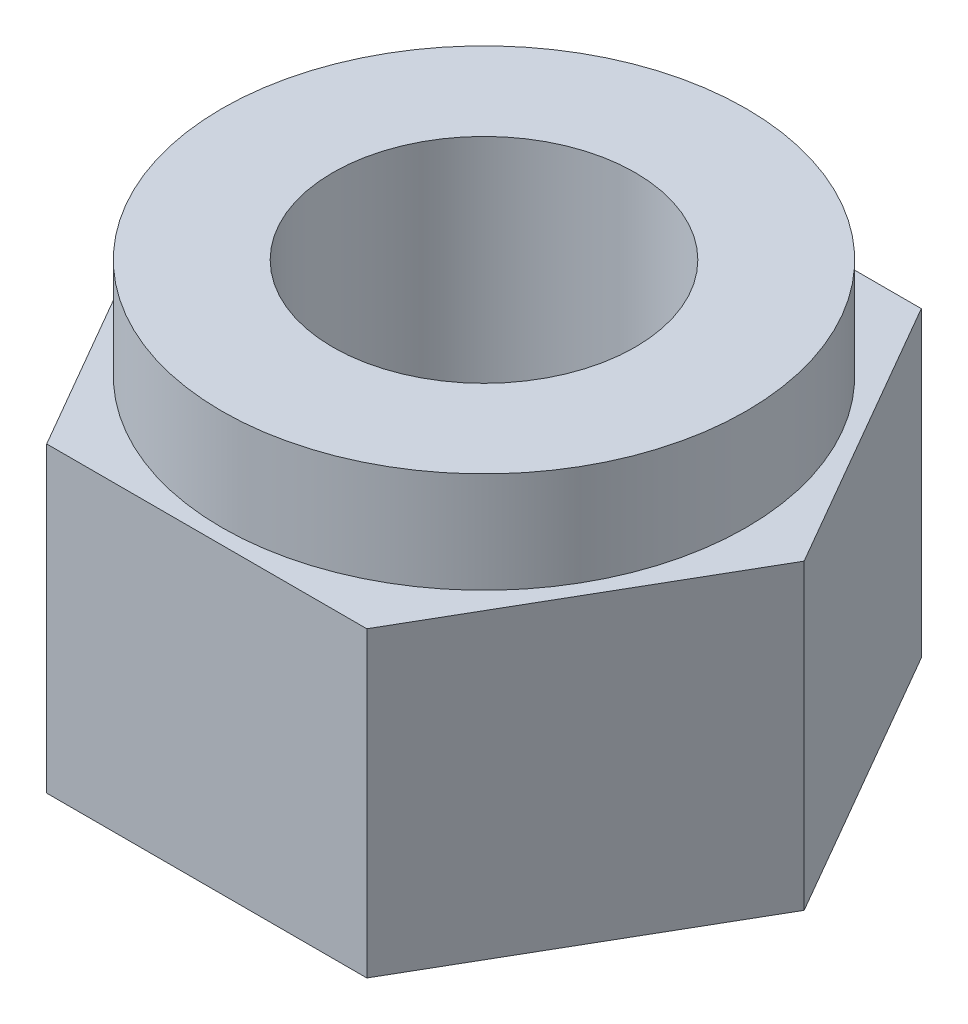
ISO-10303-21;
HEADER;
FILE_DESCRIPTION(('STEP AP214'),'2;1');
FILE_NAME('part.step','',(''),(''),'','','');
FILE_SCHEMA(('AUTOMOTIVE_DESIGN { 1 0 10303 214 1 1 1 1 }'));
ENDSEC;
DATA;
#1=APPLICATION_CONTEXT('core data for automotive mechanical design processes');
#2=APPLICATION_PROTOCOL_DEFINITION('international standard','automotive_design',2000,#1);
#3=PRODUCT_CONTEXT('',#1,'mechanical');
#4=PRODUCT('Part','Part','',(#3));
#5=PRODUCT_RELATED_PRODUCT_CATEGORY('part','',(#4));
#6=PRODUCT_DEFINITION_FORMATION('','',#4);
#7=PRODUCT_DEFINITION_CONTEXT('part definition',#1,'design');
#8=PRODUCT_DEFINITION('design','',#6,#7);
#9=PRODUCT_DEFINITION_SHAPE('','',#8);
#10=(LENGTH_UNIT() NAMED_UNIT(*) SI_UNIT(.MILLI.,.METRE.));
#11=(NAMED_UNIT(*) PLANE_ANGLE_UNIT() SI_UNIT($,.RADIAN.));
#12=(NAMED_UNIT(*) SI_UNIT($,.STERADIAN.) SOLID_ANGLE_UNIT());
#13=UNCERTAINTY_MEASURE_WITH_UNIT(LENGTH_MEASURE(1.E-05),#10,'distance_accuracy_value','');
#14=(GEOMETRIC_REPRESENTATION_CONTEXT(3) GLOBAL_UNCERTAINTY_ASSIGNED_CONTEXT((#13)) GLOBAL_UNIT_ASSIGNED_CONTEXT((#10,
#11,#12)) REPRESENTATION_CONTEXT('',''));
#15=CARTESIAN_POINT('',(0.,0.,0.));
#16=DIRECTION('',(0.,0.,1.));
#17=DIRECTION('',(1.,0.,0.));
#18=AXIS2_PLACEMENT_3D('',#15,#16,#17);
#19=CARTESIAN_POINT('',(1.5877132402715,3.,2.74999999999998));
#20=DIRECTION('',(-0.866025403784441,0.,-0.499999999999995));
#21=DIRECTION('',(-0.499999999999995,0.,0.866025403784441));
#22=AXIS2_PLACEMENT_3D('',#19,#20,#21);
#23=PLANE('',#22);
#24=DIRECTION('',(0.499999999999995,0.,-0.866025403784441));
#25=VECTOR('',#24,1.);
#26=CARTESIAN_POINT('',(1.5877132402715,0.,2.74999999999998));
#27=LINE('',#26,#25);
#28=CARTESIAN_POINT('',(1.5877132402715,0.,2.74999999999998));
#29=VERTEX_POINT('',#28);
#30=CARTESIAN_POINT('',(3.17542648054294,0.,0.));
#31=VERTEX_POINT('',#30);
#32=EDGE_CURVE('E123',#29,#31,#27,.T.);
#33=ORIENTED_EDGE('',*,*,#32,.T.);
#34=DIRECTION('',(0.,-1.,0.));
#35=VECTOR('',#34,1.);
#36=CARTESIAN_POINT('',(3.17542648054294,3.,0.));
#37=LINE('',#36,#35);
#38=CARTESIAN_POINT('',(3.17542648054294,3.,0.));
#39=VERTEX_POINT('',#38);
#40=EDGE_CURVE('E11',#39,#31,#37,.T.);
#41=ORIENTED_EDGE('',*,*,#40,.F.);
#42=DIRECTION('',(0.499999999999995,0.,-0.866025403784441));
#43=VECTOR('',#42,1.);
#44=CARTESIAN_POINT('',(1.5877132402715,3.,2.74999999999998));
#45=LINE('',#44,#43);
#46=CARTESIAN_POINT('',(1.5877132402715,3.,2.74999999999998));
#47=VERTEX_POINT('',#46);
#48=EDGE_CURVE('E134',#47,#39,#45,.T.);
#49=ORIENTED_EDGE('',*,*,#48,.F.);
#50=DIRECTION('',(0.,-1.,0.));
#51=VECTOR('',#50,1.);
#52=CARTESIAN_POINT('',(1.5877132402715,3.,2.74999999999998));
#53=LINE('',#52,#51);
#54=EDGE_CURVE('E119',#47,#29,#53,.T.);
#55=ORIENTED_EDGE('',*,*,#54,.T.);
#56=EDGE_LOOP('',(#33,#41,#49,#55));
#57=FACE_BOUND('',#56,.T.);
#58=ADVANCED_FACE('F39',(#57),#23,.F.);
#59=CARTESIAN_POINT('',(3.17542648054294,3.,0.));
#60=DIRECTION('',(-0.866025403784438,0.,0.500000000000001));
#61=DIRECTION('',(0.500000000000001,0.,0.866025403784438));
#62=AXIS2_PLACEMENT_3D('',#59,#60,#61);
#63=PLANE('',#62);
#64=DIRECTION('',(-0.500000000000001,0.,-0.866025403784438));
#65=VECTOR('',#64,1.);
#66=CARTESIAN_POINT('',(3.17542648054294,0.,0.));
#67=LINE('',#66,#65);
#68=CARTESIAN_POINT('',(1.58771324027146,0.,-2.75));
#69=VERTEX_POINT('',#68);
#70=EDGE_CURVE('E126',#31,#69,#67,.T.);
#71=ORIENTED_EDGE('',*,*,#70,.T.);
#72=DIRECTION('',(0.,-1.,0.));
#73=VECTOR('',#72,1.);
#74=CARTESIAN_POINT('',(1.58771324027146,3.,-2.75));
#75=LINE('',#74,#73);
#76=CARTESIAN_POINT('',(1.58771324027146,3.,-2.75));
#77=VERTEX_POINT('',#76);
#78=EDGE_CURVE('E47',#77,#69,#75,.T.);
#79=ORIENTED_EDGE('',*,*,#78,.F.);
#80=DIRECTION('',(-0.500000000000001,0.,-0.866025403784438));
#81=VECTOR('',#80,1.);
#82=CARTESIAN_POINT('',(3.17542648054294,3.,0.));
#83=LINE('',#82,#81);
#84=EDGE_CURVE('E92',#39,#77,#83,.T.);
#85=ORIENTED_EDGE('',*,*,#84,.F.);
#86=ORIENTED_EDGE('',*,*,#40,.T.);
#87=EDGE_LOOP('',(#71,#79,#85,#86));
#88=FACE_BOUND('',#87,.T.);
#89=ADVANCED_FACE('F159',(#88),#63,.F.);
#90=CARTESIAN_POINT('',(1.58771324027146,3.,-2.75));
#91=DIRECTION('',(0.,0.,1.));
#92=DIRECTION('',(1.,0.,0.));
#93=AXIS2_PLACEMENT_3D('',#90,#91,#92);
#94=PLANE('',#93);
#95=DIRECTION('',(-1.,0.,0.));
#96=VECTOR('',#95,1.);
#97=CARTESIAN_POINT('',(1.58771324027146,0.,-2.75));
#98=LINE('',#97,#96);
#99=CARTESIAN_POINT('',(-1.58771324027148,0.,-2.74999999999999));
#100=VERTEX_POINT('',#99);
#101=EDGE_CURVE('E129',#69,#100,#98,.T.);
#102=ORIENTED_EDGE('',*,*,#101,.T.);
#103=DIRECTION('',(0.,-1.,0.));
#104=VECTOR('',#103,1.);
#105=CARTESIAN_POINT('',(-1.58771324027148,3.,-2.74999999999999));
#106=LINE('',#105,#104);
#107=CARTESIAN_POINT('',(-1.58771324027148,3.,-2.74999999999999));
#108=VERTEX_POINT('',#107);
#109=EDGE_CURVE('E114',#108,#100,#106,.T.);
#110=ORIENTED_EDGE('',*,*,#109,.F.);
#111=DIRECTION('',(-1.,0.,0.));
#112=VECTOR('',#111,1.);
#113=CARTESIAN_POINT('',(1.58771324027146,3.,-2.75));
#114=LINE('',#113,#112);
#115=EDGE_CURVE('E105',#77,#108,#114,.T.);
#116=ORIENTED_EDGE('',*,*,#115,.F.);
#117=ORIENTED_EDGE('',*,*,#78,.T.);
#118=EDGE_LOOP('',(#102,#110,#116,#117));
#119=FACE_BOUND('',#118,.T.);
#120=ADVANCED_FACE('F140',(#119),#94,.F.);
#121=CARTESIAN_POINT('',(-1.58771324027148,3.,-2.74999999999999));
#122=DIRECTION('',(0.86602540378444,0.,0.499999999999998));
#123=DIRECTION('',(0.499999999999998,0.,-0.86602540378444));
#124=AXIS2_PLACEMENT_3D('',#121,#122,#123);
#125=PLANE('',#124);
#126=DIRECTION('',(-0.499999999999998,0.,0.86602540378444));
#127=VECTOR('',#126,1.);
#128=CARTESIAN_POINT('',(-1.58771324027148,0.,-2.74999999999999));
#129=LINE('',#128,#127);
#130=CARTESIAN_POINT('',(-3.17542648054294,0.,0.));
#131=VERTEX_POINT('',#130);
#132=EDGE_CURVE('E113',#100,#131,#129,.T.);
#133=ORIENTED_EDGE('',*,*,#132,.T.);
#134=DIRECTION('',(0.,-1.,0.));
#135=VECTOR('',#134,1.);
#136=CARTESIAN_POINT('',(-3.17542648054294,3.,0.));
#137=LINE('',#136,#135);
#138=CARTESIAN_POINT('',(-3.17542648054294,3.,0.));
#139=VERTEX_POINT('',#138);
#140=EDGE_CURVE('E110',#139,#131,#137,.T.);
#141=ORIENTED_EDGE('',*,*,#140,.F.);
#142=DIRECTION('',(-0.499999999999998,0.,0.86602540378444));
#143=VECTOR('',#142,1.);
#144=CARTESIAN_POINT('',(-1.58771324027148,3.,-2.74999999999999));
#145=LINE('',#144,#143);
#146=EDGE_CURVE('E99',#108,#139,#145,.T.);
#147=ORIENTED_EDGE('',*,*,#146,.F.);
#148=ORIENTED_EDGE('',*,*,#109,.T.);
#149=EDGE_LOOP('',(#133,#141,#147,#148));
#150=FACE_BOUND('',#149,.T.);
#151=ADVANCED_FACE('F111',(#150),#125,.F.);
#152=CARTESIAN_POINT('',(-3.17542648054294,3.,0.));
#153=DIRECTION('',(0.866025403784438,0.,-0.5));
#154=DIRECTION('',(-0.5,0.,-0.866025403784439));
#155=AXIS2_PLACEMENT_3D('',#152,#153,#154);
#156=PLANE('',#155);
#157=DIRECTION('',(0.5,0.,0.866025403784438));
#158=VECTOR('',#157,1.);
#159=CARTESIAN_POINT('',(-3.17542648054294,0.,0.));
#160=LINE('',#159,#158);
#161=CARTESIAN_POINT('',(-1.58771324027147,0.,2.75));
#162=VERTEX_POINT('',#161);
#163=EDGE_CURVE('E78',#131,#162,#160,.T.);
#164=ORIENTED_EDGE('',*,*,#163,.T.);
#165=DIRECTION('',(0.,-1.,0.));
#166=VECTOR('',#165,1.);
#167=CARTESIAN_POINT('',(-1.58771324027147,3.,2.75));
#168=LINE('',#167,#166);
#169=CARTESIAN_POINT('',(-1.58771324027147,3.,2.75));
#170=VERTEX_POINT('',#169);
#171=EDGE_CURVE('E115',#170,#162,#168,.T.);
#172=ORIENTED_EDGE('',*,*,#171,.F.);
#173=DIRECTION('',(0.5,0.,0.866025403784438));
#174=VECTOR('',#173,1.);
#175=CARTESIAN_POINT('',(-3.17542648054294,3.,0.));
#176=LINE('',#175,#174);
#177=EDGE_CURVE('E103',#139,#170,#176,.T.);
#178=ORIENTED_EDGE('',*,*,#177,.F.);
#179=ORIENTED_EDGE('',*,*,#140,.T.);
#180=EDGE_LOOP('',(#164,#172,#178,#179));
#181=FACE_BOUND('',#180,.T.);
#182=ADVANCED_FACE('F117',(#181),#156,.F.);
#183=CARTESIAN_POINT('',(-1.58771324027147,3.,2.75));
#184=DIRECTION('',(0.,0.,-1.));
#185=DIRECTION('',(-1.,0.,0.));
#186=AXIS2_PLACEMENT_3D('',#183,#184,#185);
#187=PLANE('',#186);
#188=DIRECTION('',(1.,0.,0.));
#189=VECTOR('',#188,1.);
#190=CARTESIAN_POINT('',(-1.58771324027147,0.,2.75));
#191=LINE('',#190,#189);
#192=EDGE_CURVE('E84',#162,#29,#191,.T.);
#193=ORIENTED_EDGE('',*,*,#192,.T.);
#194=ORIENTED_EDGE('',*,*,#54,.F.);
#195=DIRECTION('',(1.,0.,0.));
#196=VECTOR('',#195,1.);
#197=CARTESIAN_POINT('',(-1.58771324027147,3.,2.75));
#198=LINE('',#197,#196);
#199=EDGE_CURVE('E55',#170,#47,#198,.T.);
#200=ORIENTED_EDGE('',*,*,#199,.F.);
#201=ORIENTED_EDGE('',*,*,#171,.T.);
#202=EDGE_LOOP('',(#193,#194,#200,#201));
#203=FACE_BOUND('',#202,.T.);
#204=ADVANCED_FACE('F147',(#203),#187,.F.);
#205=CARTESIAN_POINT('',(0.,3.,0.));
#206=DIRECTION('',(0.,1.,0.));
#207=DIRECTION('',(0.,0.,1.));
#208=AXIS2_PLACEMENT_3D('',#205,#206,#207);
#209=PLANE('',#208);
#210=CARTESIAN_POINT('',(0.,3.,0.));
#211=DIRECTION('',(0.,1.,0.));
#212=DIRECTION('',(0.,0.,1.));
#213=AXIS2_PLACEMENT_3D('',#210,#211,#212);
#214=CIRCLE('',#213,2.6);
#215=CARTESIAN_POINT('',(0.,3.,2.6));
#216=VERTEX_POINT('',#215);
#217=EDGE_CURVE('E241',#216,#216,#214,.T.);
#218=ORIENTED_EDGE('',*,*,#217,.F.);
#219=EDGE_LOOP('',(#218));
#220=FACE_BOUND('',#219,.T.);
#221=ORIENTED_EDGE('',*,*,#48,.T.);
#222=ORIENTED_EDGE('',*,*,#84,.T.);
#223=ORIENTED_EDGE('',*,*,#115,.T.);
#224=ORIENTED_EDGE('',*,*,#146,.T.);
#225=ORIENTED_EDGE('',*,*,#177,.T.);
#226=ORIENTED_EDGE('',*,*,#199,.T.);
#227=EDGE_LOOP('',(#221,#222,#223,#224,#225,#226));
#228=FACE_BOUND('',#227,.T.);
#229=ADVANCED_FACE('F101',(#220,#228),#209,.T.);
#230=CARTESIAN_POINT('',(0.,0.,0.));
#231=DIRECTION('',(0.,1.,0.));
#232=DIRECTION('',(0.,0.,1.));
#233=AXIS2_PLACEMENT_3D('',#230,#231,#232);
#234=PLANE('',#233);
#235=CARTESIAN_POINT('',(0.,0.,0.));
#236=DIRECTION('',(0.,1.,0.));
#237=DIRECTION('',(0.,0.,1.));
#238=AXIS2_PLACEMENT_3D('',#235,#236,#237);
#239=CIRCLE('',#238,1.5);
#240=CARTESIAN_POINT('',(0.,0.,1.5));
#241=VERTEX_POINT('',#240);
#242=EDGE_CURVE('E239',#241,#241,#239,.T.);
#243=ORIENTED_EDGE('',*,*,#242,.T.);
#244=EDGE_LOOP('',(#243));
#245=FACE_BOUND('',#244,.T.);
#246=ORIENTED_EDGE('',*,*,#32,.F.);
#247=ORIENTED_EDGE('',*,*,#192,.F.);
#248=ORIENTED_EDGE('',*,*,#163,.F.);
#249=ORIENTED_EDGE('',*,*,#132,.F.);
#250=ORIENTED_EDGE('',*,*,#101,.F.);
#251=ORIENTED_EDGE('',*,*,#70,.F.);
#252=EDGE_LOOP('',(#246,#247,#248,#249,#250,#251));
#253=FACE_BOUND('',#252,.T.);
#254=ADVANCED_FACE('F143',(#245,#253),#234,.F.);
#255=CARTESIAN_POINT('',(0.,4.,0.));
#256=DIRECTION('',(0.,1.,0.));
#257=DIRECTION('',(0.,0.,1.));
#258=AXIS2_PLACEMENT_3D('',#255,#256,#257);
#259=PLANE('',#258);
#260=CARTESIAN_POINT('',(0.,4.,0.));
#261=DIRECTION('',(0.,1.,0.));
#262=DIRECTION('',(0.,0.,1.));
#263=AXIS2_PLACEMENT_3D('',#260,#261,#262);
#264=CIRCLE('',#263,2.6);
#265=CARTESIAN_POINT('',(0.,4.,2.6));
#266=VERTEX_POINT('',#265);
#267=EDGE_CURVE('E127',#266,#266,#264,.T.);
#268=ORIENTED_EDGE('',*,*,#267,.T.);
#269=EDGE_LOOP('',(#268));
#270=FACE_BOUND('',#269,.T.);
#271=CARTESIAN_POINT('',(0.,4.,0.));
#272=DIRECTION('',(0.,1.,0.));
#273=DIRECTION('',(0.,0.,1.));
#274=AXIS2_PLACEMENT_3D('',#271,#272,#273);
#275=CIRCLE('',#274,1.5);
#276=CARTESIAN_POINT('',(0.,4.,1.5));
#277=VERTEX_POINT('',#276);
#278=EDGE_CURVE('E236',#277,#277,#275,.T.);
#279=ORIENTED_EDGE('',*,*,#278,.F.);
#280=EDGE_LOOP('',(#279));
#281=FACE_BOUND('',#280,.T.);
#282=ADVANCED_FACE('F199',(#270,#281),#259,.T.);
#283=CARTESIAN_POINT('',(0.,4.,0.));
#284=DIRECTION('',(0.,-1.,0.));
#285=DIRECTION('',(0.,0.,-1.));
#286=AXIS2_PLACEMENT_3D('',#283,#284,#285);
#287=CYLINDRICAL_SURFACE('',#286,2.6);
#288=ORIENTED_EDGE('',*,*,#267,.F.);
#289=EDGE_LOOP('',(#288));
#290=FACE_BOUND('',#289,.T.);
#291=ORIENTED_EDGE('',*,*,#217,.T.);
#292=EDGE_LOOP('',(#291));
#293=FACE_BOUND('',#292,.T.);
#294=ADVANCED_FACE('F209',(#290,#293),#287,.T.);
#295=CARTESIAN_POINT('',(0.,4.,0.));
#296=DIRECTION('',(0.,-1.,0.));
#297=DIRECTION('',(0.,0.,-1.));
#298=AXIS2_PLACEMENT_3D('',#295,#296,#297);
#299=CYLINDRICAL_SURFACE('',#298,1.5);
#300=ORIENTED_EDGE('',*,*,#278,.T.);
#301=EDGE_LOOP('',(#300));
#302=FACE_BOUND('',#301,.T.);
#303=ORIENTED_EDGE('',*,*,#242,.F.);
#304=EDGE_LOOP('',(#303));
#305=FACE_BOUND('',#304,.T.);
#306=ADVANCED_FACE('F218',(#302,#305),#299,.F.);
#307=CLOSED_SHELL('',(#58,#89,#120,#151,#182,#204,#229,#254,#282,#294,#306));
#308=MANIFOLD_SOLID_BREP('B2',#307);
#309=ADVANCED_BREP_SHAPE_REPRESENTATION('',(#18,#308),#14);
#310=SHAPE_DEFINITION_REPRESENTATION(#9,#309);
ENDSEC;
END-ISO-10303-21;
